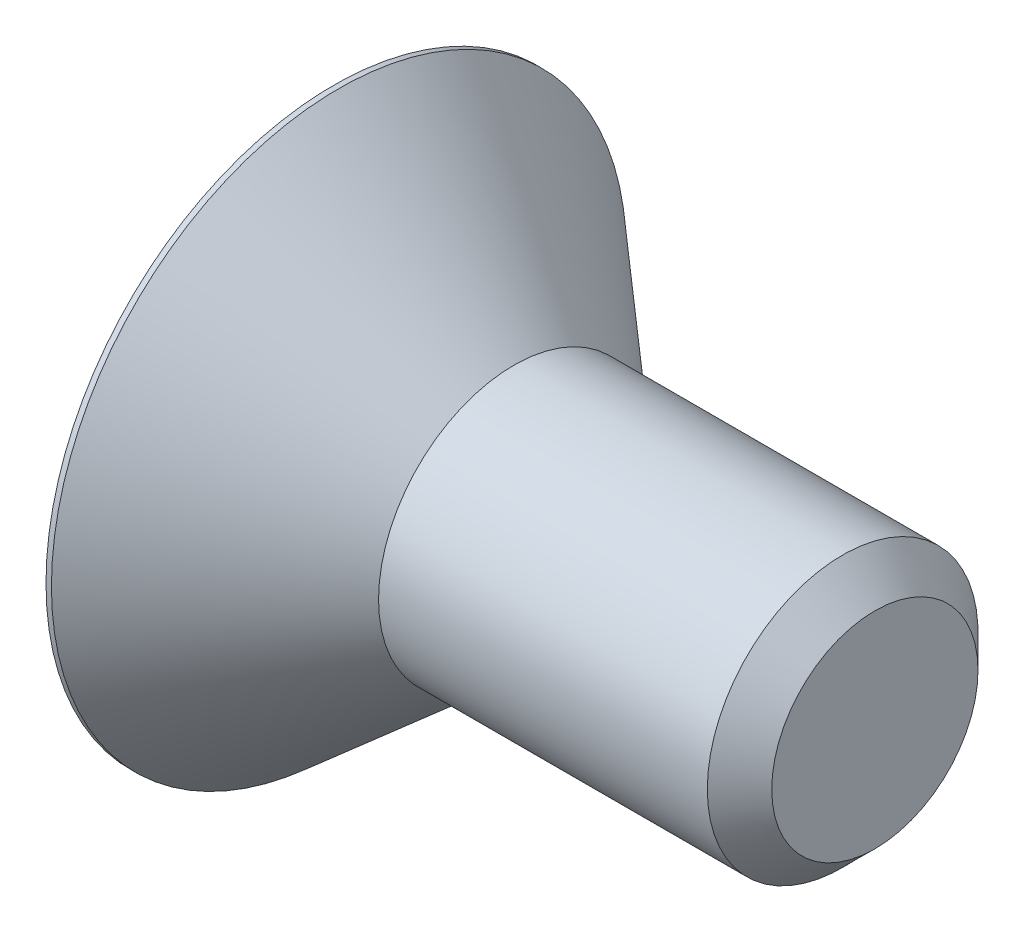
ISO-10303-21;
HEADER;
FILE_DESCRIPTION(('STEP AP214'),'2;1');
FILE_NAME('part.step','',(''),(''),'','','');
FILE_SCHEMA(('AUTOMOTIVE_DESIGN { 1 0 10303 214 1 1 1 1 }'));
ENDSEC;
DATA;
#1=APPLICATION_CONTEXT('core data for automotive mechanical design processes');
#2=APPLICATION_PROTOCOL_DEFINITION('international standard','automotive_design',2000,#1);
#3=PRODUCT_CONTEXT('',#1,'mechanical');
#4=PRODUCT('Part','Part','',(#3));
#5=PRODUCT_RELATED_PRODUCT_CATEGORY('part','',(#4));
#6=PRODUCT_DEFINITION_FORMATION('','',#4);
#7=PRODUCT_DEFINITION_CONTEXT('part definition',#1,'design');
#8=PRODUCT_DEFINITION('design','',#6,#7);
#9=PRODUCT_DEFINITION_SHAPE('','',#8);
#10=(LENGTH_UNIT() NAMED_UNIT(*) SI_UNIT(.MILLI.,.METRE.));
#11=(NAMED_UNIT(*) PLANE_ANGLE_UNIT() SI_UNIT($,.RADIAN.));
#12=(NAMED_UNIT(*) SI_UNIT($,.STERADIAN.) SOLID_ANGLE_UNIT());
#13=UNCERTAINTY_MEASURE_WITH_UNIT(LENGTH_MEASURE(1.E-05),#10,'distance_accuracy_value','');
#14=(GEOMETRIC_REPRESENTATION_CONTEXT(3) GLOBAL_UNCERTAINTY_ASSIGNED_CONTEXT((#13)) GLOBAL_UNIT_ASSIGNED_CONTEXT((#10,
#11,#12)) REPRESENTATION_CONTEXT('',''));
#15=CARTESIAN_POINT('',(0.,0.,0.));
#16=DIRECTION('',(0.,0.,1.));
#17=DIRECTION('',(1.,0.,0.));
#18=AXIS2_PLACEMENT_3D('',#15,#16,#17);
#19=CARTESIAN_POINT('',(0.,0.,0.));
#20=DIRECTION('',(-1.,0.,0.));
#21=DIRECTION('',(0.,0.,1.));
#22=AXIS2_PLACEMENT_3D('',#19,#20,#21);
#23=PLANE('',#22);
#24=CARTESIAN_POINT('',(0.,0.,0.));
#25=DIRECTION('',(-1.,0.,0.));
#26=DIRECTION('',(0.,0.,1.));
#27=AXIS2_PLACEMENT_3D('',#24,#25,#26);
#28=CIRCLE('',#27,6.7437);
#29=CARTESIAN_POINT('',(0.,0.,6.7437));
#30=VERTEX_POINT('',#29);
#31=EDGE_CURVE('E11',#30,#30,#28,.T.);
#32=ORIENTED_EDGE('',*,*,#31,.T.);
#33=EDGE_LOOP('',(#32));
#34=FACE_BOUND('',#33,.T.);
#35=DIRECTION('',(0.,-0.5,-0.866025403784439));
#36=VECTOR('',#35,1.);
#37=CARTESIAN_POINT('',(0.,-1.14384635331848,1.9812));
#38=LINE('',#37,#36);
#39=CARTESIAN_POINT('',(0.,-1.14384635331848,1.9812));
#40=VERTEX_POINT('',#39);
#41=CARTESIAN_POINT('',(0.,-2.28769270663697,0.));
#42=VERTEX_POINT('',#41);
#43=EDGE_CURVE('E125',#40,#42,#38,.T.);
#44=ORIENTED_EDGE('',*,*,#43,.T.);
#45=DIRECTION('',(0.,0.5,-0.866025403784439));
#46=VECTOR('',#45,1.);
#47=CARTESIAN_POINT('',(0.,-2.28769270663697,0.));
#48=LINE('',#47,#46);
#49=CARTESIAN_POINT('',(0.,-1.14384635331848,-1.9812));
#50=VERTEX_POINT('',#49);
#51=EDGE_CURVE('E47',#42,#50,#48,.T.);
#52=ORIENTED_EDGE('',*,*,#51,.T.);
#53=DIRECTION('',(0.,1.,0.));
#54=VECTOR('',#53,1.);
#55=CARTESIAN_POINT('',(0.,-1.14384635331848,-1.9812));
#56=LINE('',#55,#54);
#57=CARTESIAN_POINT('',(0.,1.14384635331849,-1.9812));
#58=VERTEX_POINT('',#57);
#59=EDGE_CURVE('E108',#50,#58,#56,.T.);
#60=ORIENTED_EDGE('',*,*,#59,.T.);
#61=DIRECTION('',(0.,0.5,0.866025403784439));
#62=VECTOR('',#61,1.);
#63=CARTESIAN_POINT('',(0.,1.14384635331849,-1.9812));
#64=LINE('',#63,#62);
#65=CARTESIAN_POINT('',(0.,2.28769270663697,0.));
#66=VERTEX_POINT('',#65);
#67=EDGE_CURVE('E115',#58,#66,#64,.T.);
#68=ORIENTED_EDGE('',*,*,#67,.T.);
#69=DIRECTION('',(0.,-0.5,0.866025403784439));
#70=VECTOR('',#69,1.);
#71=CARTESIAN_POINT('',(0.,2.28769270663697,0.));
#72=LINE('',#71,#70);
#73=CARTESIAN_POINT('',(0.,1.14384635331849,1.9812));
#74=VERTEX_POINT('',#73);
#75=EDGE_CURVE('E129',#66,#74,#72,.T.);
#76=ORIENTED_EDGE('',*,*,#75,.T.);
#77=DIRECTION('',(0.,-1.,0.));
#78=VECTOR('',#77,1.);
#79=CARTESIAN_POINT('',(0.,1.14384635331849,1.9812));
#80=LINE('',#79,#78);
#81=EDGE_CURVE('E132',#74,#40,#80,.T.);
#82=ORIENTED_EDGE('',*,*,#81,.T.);
#83=EDGE_LOOP('',(#44,#52,#60,#68,#76,#82));
#84=FACE_BOUND('',#83,.T.);
#85=ADVANCED_FACE('F33',(#34,#84),#23,.T.);
#86=CARTESIAN_POINT('',(0.,0.,0.));
#87=DIRECTION('',(-1.,0.,0.));
#88=DIRECTION('',(0.,0.,1.));
#89=AXIS2_PLACEMENT_3D('',#86,#87,#88);
#90=CYLINDRICAL_SURFACE('',#89,6.7437);
#91=CARTESIAN_POINT('',(0.127,0.,0.));
#92=DIRECTION('',(-1.,0.,0.));
#93=DIRECTION('',(0.,0.,1.));
#94=AXIS2_PLACEMENT_3D('',#91,#92,#93);
#95=CIRCLE('',#94,6.7437);
#96=CARTESIAN_POINT('',(0.127,0.,6.7437));
#97=VERTEX_POINT('',#96);
#98=EDGE_CURVE('E40',#97,#97,#95,.T.);
#99=ORIENTED_EDGE('',*,*,#98,.T.);
#100=EDGE_LOOP('',(#99));
#101=FACE_BOUND('',#100,.T.);
#102=ORIENTED_EDGE('',*,*,#31,.F.);
#103=EDGE_LOOP('',(#102));
#104=FACE_BOUND('',#103,.T.);
#105=ADVANCED_FACE('F182',(#101,#104),#90,.T.);
#106=CARTESIAN_POINT('',(0.127,0.,0.));
#107=DIRECTION('',(-1.,0.,0.));
#108=DIRECTION('',(0.,0.,1.));
#109=AXIS2_PLACEMENT_3D('',#106,#107,#108);
#110=CONICAL_SURFACE('',#109,6.7437,0.715584993317677);
#111=CARTESIAN_POINT('',(4.2323197348496,0.,0.));
#112=DIRECTION('',(-1.,0.,0.));
#113=DIRECTION('',(0.,0.,1.));
#114=AXIS2_PLACEMENT_3D('',#111,#112,#113);
#115=CIRCLE('',#114,3.175);
#116=CARTESIAN_POINT('',(4.2323197348496,0.,3.175));
#117=VERTEX_POINT('',#116);
#118=EDGE_CURVE('E177',#117,#117,#115,.T.);
#119=ORIENTED_EDGE('',*,*,#118,.T.);
#120=EDGE_LOOP('',(#119));
#121=FACE_BOUND('',#120,.T.);
#122=ORIENTED_EDGE('',*,*,#98,.F.);
#123=EDGE_LOOP('',(#122));
#124=FACE_BOUND('',#123,.T.);
#125=ADVANCED_FACE('F185',(#121,#124),#110,.T.);
#126=CARTESIAN_POINT('',(0.,0.,0.));
#127=DIRECTION('',(-1.,0.,0.));
#128=DIRECTION('',(0.,0.,1.));
#129=AXIS2_PLACEMENT_3D('',#126,#127,#128);
#130=CYLINDRICAL_SURFACE('',#129,3.175);
#131=CARTESIAN_POINT('',(11.94435,0.,0.));
#132=DIRECTION('',(-1.,0.,0.));
#133=DIRECTION('',(0.,0.,1.));
#134=AXIS2_PLACEMENT_3D('',#131,#132,#133);
#135=CIRCLE('',#134,3.175);
#136=CARTESIAN_POINT('',(11.94435,0.,3.175));
#137=VERTEX_POINT('',#136);
#138=EDGE_CURVE('E174',#137,#137,#135,.T.);
#139=ORIENTED_EDGE('',*,*,#138,.T.);
#140=EDGE_LOOP('',(#139));
#141=FACE_BOUND('',#140,.T.);
#142=ORIENTED_EDGE('',*,*,#118,.F.);
#143=EDGE_LOOP('',(#142));
#144=FACE_BOUND('',#143,.T.);
#145=ADVANCED_FACE('F187',(#141,#144),#130,.T.);
#146=CARTESIAN_POINT('',(12.7,0.,0.));
#147=DIRECTION('',(-1.,0.,0.));
#148=DIRECTION('',(0.,0.,1.));
#149=AXIS2_PLACEMENT_3D('',#146,#147,#148);
#150=CONICAL_SURFACE('',#149,2.41935,0.785398163397453);
#151=ORIENTED_EDGE('',*,*,#138,.F.);
#152=EDGE_LOOP('',(#151));
#153=FACE_BOUND('',#152,.T.);
#154=CARTESIAN_POINT('',(12.7,0.,0.));
#155=DIRECTION('',(-1.,0.,0.));
#156=DIRECTION('',(0.,0.,1.));
#157=AXIS2_PLACEMENT_3D('',#154,#155,#156);
#158=CIRCLE('',#157,2.41935);
#159=CARTESIAN_POINT('',(12.7,0.,2.41935));
#160=VERTEX_POINT('',#159);
#161=EDGE_CURVE('E170',#160,#160,#158,.T.);
#162=ORIENTED_EDGE('',*,*,#161,.T.);
#163=EDGE_LOOP('',(#162));
#164=FACE_BOUND('',#163,.T.);
#165=ADVANCED_FACE('F194',(#153,#164),#150,.T.);
#166=CARTESIAN_POINT('',(12.7,2.41935,0.));
#167=DIRECTION('',(1.,0.,0.));
#168=DIRECTION('',(0.,0.,-1.));
#169=AXIS2_PLACEMENT_3D('',#166,#167,#168);
#170=PLANE('',#169);
#171=ORIENTED_EDGE('',*,*,#161,.F.);
#172=EDGE_LOOP('',(#171));
#173=FACE_BOUND('',#172,.T.);
#174=ADVANCED_FACE('F226',(#173),#170,.T.);
#175=CARTESIAN_POINT('',(2.8194,-2.28769270663697,0.));
#176=DIRECTION('',(0.,0.866025403784439,0.5));
#177=DIRECTION('',(0.,-0.5,0.866025403784439));
#178=AXIS2_PLACEMENT_3D('',#175,#176,#177);
#179=PLANE('',#178);
#180=ORIENTED_EDGE('',*,*,#51,.F.);
#181=DIRECTION('',(-1.,0.,0.));
#182=VECTOR('',#181,1.);
#183=CARTESIAN_POINT('',(2.8194,-2.28769270663697,0.));
#184=LINE('',#183,#182);
#185=CARTESIAN_POINT('',(2.8194,-2.28769270663697,0.));
#186=VERTEX_POINT('',#185);
#187=EDGE_CURVE('E155',#186,#42,#184,.T.);
#188=ORIENTED_EDGE('',*,*,#187,.F.);
#189=DIRECTION('',(0.,0.5,-0.866025403784439));
#190=VECTOR('',#189,1.);
#191=CARTESIAN_POINT('',(2.8194,-2.28769270663697,0.));
#192=LINE('',#191,#190);
#193=CARTESIAN_POINT('',(2.8194,-1.71576952997773,-0.990599999999999));
#194=VERTEX_POINT('',#193);
#195=EDGE_CURVE('E135',#186,#194,#192,.T.);
#196=ORIENTED_EDGE('',*,*,#195,.T.);
#197=CARTESIAN_POINT('',(2.8194,-1.14384635331848,-1.9812));
#198=VERTEX_POINT('',#197);
#199=EDGE_CURVE('E120',#194,#198,#192,.T.);
#200=ORIENTED_EDGE('',*,*,#199,.T.);
#201=DIRECTION('',(-1.,0.,0.));
#202=VECTOR('',#201,1.);
#203=CARTESIAN_POINT('',(2.8194,-1.14384635331848,-1.9812));
#204=LINE('',#203,#202);
#205=EDGE_CURVE('E110',#198,#50,#204,.T.);
#206=ORIENTED_EDGE('',*,*,#205,.T.);
#207=EDGE_LOOP('',(#180,#188,#196,#200,#206));
#208=FACE_BOUND('',#207,.T.);
#209=ADVANCED_FACE('F117',(#208),#179,.T.);
#210=CARTESIAN_POINT('',(2.8194,-1.14384635331848,-1.9812));
#211=DIRECTION('',(0.,0.,1.));
#212=DIRECTION('',(1.,0.,0.));
#213=AXIS2_PLACEMENT_3D('',#210,#211,#212);
#214=PLANE('',#213);
#215=ORIENTED_EDGE('',*,*,#59,.F.);
#216=ORIENTED_EDGE('',*,*,#205,.F.);
#217=DIRECTION('',(0.,1.,0.));
#218=VECTOR('',#217,1.);
#219=CARTESIAN_POINT('',(2.8194,-1.14384635331848,-1.9812));
#220=LINE('',#219,#218);
#221=CARTESIAN_POINT('',(2.8194,0.,-1.9812));
#222=VERTEX_POINT('',#221);
#223=EDGE_CURVE('E55',#198,#222,#220,.T.);
#224=ORIENTED_EDGE('',*,*,#223,.T.);
#225=CARTESIAN_POINT('',(2.8194,1.14384635331849,-1.9812));
#226=VERTEX_POINT('',#225);
#227=EDGE_CURVE('E137',#222,#226,#220,.T.);
#228=ORIENTED_EDGE('',*,*,#227,.T.);
#229=DIRECTION('',(-1.,0.,0.));
#230=VECTOR('',#229,1.);
#231=CARTESIAN_POINT('',(2.8194,1.14384635331849,-1.9812));
#232=LINE('',#231,#230);
#233=EDGE_CURVE('E112',#226,#58,#232,.T.);
#234=ORIENTED_EDGE('',*,*,#233,.T.);
#235=EDGE_LOOP('',(#215,#216,#224,#228,#234));
#236=FACE_BOUND('',#235,.T.);
#237=ADVANCED_FACE('F109',(#236),#214,.T.);
#238=CARTESIAN_POINT('',(2.8194,1.14384635331849,-1.9812));
#239=DIRECTION('',(0.,-0.866025403784439,0.5));
#240=DIRECTION('',(0.,-0.5,-0.866025403784439));
#241=AXIS2_PLACEMENT_3D('',#238,#239,#240);
#242=PLANE('',#241);
#243=ORIENTED_EDGE('',*,*,#67,.F.);
#244=ORIENTED_EDGE('',*,*,#233,.F.);
#245=DIRECTION('',(0.,0.5,0.866025403784439));
#246=VECTOR('',#245,1.);
#247=CARTESIAN_POINT('',(2.8194,1.14384635331849,-1.9812));
#248=LINE('',#247,#246);
#249=CARTESIAN_POINT('',(2.8194,1.71576952997773,-0.9906));
#250=VERTEX_POINT('',#249);
#251=EDGE_CURVE('E140',#226,#250,#248,.T.);
#252=ORIENTED_EDGE('',*,*,#251,.T.);
#253=CARTESIAN_POINT('',(2.8194,2.28769270663697,0.));
#254=VERTEX_POINT('',#253);
#255=EDGE_CURVE('E139',#250,#254,#248,.T.);
#256=ORIENTED_EDGE('',*,*,#255,.T.);
#257=DIRECTION('',(-1.,0.,0.));
#258=VECTOR('',#257,1.);
#259=CARTESIAN_POINT('',(2.8194,2.28769270663697,0.));
#260=LINE('',#259,#258);
#261=EDGE_CURVE('E163',#254,#66,#260,.T.);
#262=ORIENTED_EDGE('',*,*,#261,.T.);
#263=EDGE_LOOP('',(#243,#244,#252,#256,#262));
#264=FACE_BOUND('',#263,.T.);
#265=ADVANCED_FACE('F250',(#264),#242,.T.);
#266=CARTESIAN_POINT('',(2.8194,2.28769270663697,0.));
#267=DIRECTION('',(0.,-0.866025403784439,-0.5));
#268=DIRECTION('',(0.,0.5,-0.866025403784439));
#269=AXIS2_PLACEMENT_3D('',#266,#267,#268);
#270=PLANE('',#269);
#271=ORIENTED_EDGE('',*,*,#75,.F.);
#272=ORIENTED_EDGE('',*,*,#261,.F.);
#273=DIRECTION('',(0.,-0.5,0.866025403784439));
#274=VECTOR('',#273,1.);
#275=CARTESIAN_POINT('',(2.8194,2.28769270663697,0.));
#276=LINE('',#275,#274);
#277=CARTESIAN_POINT('',(2.8194,1.71576952997773,0.9906));
#278=VERTEX_POINT('',#277);
#279=EDGE_CURVE('E144',#254,#278,#276,.T.);
#280=ORIENTED_EDGE('',*,*,#279,.T.);
#281=CARTESIAN_POINT('',(2.8194,1.14384635331849,1.9812));
#282=VERTEX_POINT('',#281);
#283=EDGE_CURVE('E143',#278,#282,#276,.T.);
#284=ORIENTED_EDGE('',*,*,#283,.T.);
#285=DIRECTION('',(-1.,0.,0.));
#286=VECTOR('',#285,1.);
#287=CARTESIAN_POINT('',(2.8194,1.14384635331849,1.9812));
#288=LINE('',#287,#286);
#289=EDGE_CURVE('E160',#282,#74,#288,.T.);
#290=ORIENTED_EDGE('',*,*,#289,.T.);
#291=EDGE_LOOP('',(#271,#272,#280,#284,#290));
#292=FACE_BOUND('',#291,.T.);
#293=ADVANCED_FACE('F257',(#292),#270,.T.);
#294=CARTESIAN_POINT('',(2.8194,1.14384635331849,1.9812));
#295=DIRECTION('',(0.,0.,-1.));
#296=DIRECTION('',(-1.,0.,0.));
#297=AXIS2_PLACEMENT_3D('',#294,#295,#296);
#298=PLANE('',#297);
#299=ORIENTED_EDGE('',*,*,#81,.F.);
#300=ORIENTED_EDGE('',*,*,#289,.F.);
#301=DIRECTION('',(0.,-1.,0.));
#302=VECTOR('',#301,1.);
#303=CARTESIAN_POINT('',(2.8194,1.14384635331849,1.9812));
#304=LINE('',#303,#302);
#305=CARTESIAN_POINT('',(2.8194,0.,1.9812));
#306=VERTEX_POINT('',#305);
#307=EDGE_CURVE('E148',#282,#306,#304,.T.);
#308=ORIENTED_EDGE('',*,*,#307,.T.);
#309=CARTESIAN_POINT('',(2.8194,-1.14384635331848,1.9812));
#310=VERTEX_POINT('',#309);
#311=EDGE_CURVE('E147',#306,#310,#304,.T.);
#312=ORIENTED_EDGE('',*,*,#311,.T.);
#313=DIRECTION('',(-1.,0.,0.));
#314=VECTOR('',#313,1.);
#315=CARTESIAN_POINT('',(2.8194,-1.14384635331848,1.9812));
#316=LINE('',#315,#314);
#317=EDGE_CURVE('E157',#310,#40,#316,.T.);
#318=ORIENTED_EDGE('',*,*,#317,.T.);
#319=EDGE_LOOP('',(#299,#300,#308,#312,#318));
#320=FACE_BOUND('',#319,.T.);
#321=ADVANCED_FACE('F265',(#320),#298,.T.);
#322=CARTESIAN_POINT('',(2.8194,-1.14384635331848,1.9812));
#323=DIRECTION('',(0.,0.866025403784439,-0.5));
#324=DIRECTION('',(0.,0.5,0.866025403784439));
#325=AXIS2_PLACEMENT_3D('',#322,#323,#324);
#326=PLANE('',#325);
#327=ORIENTED_EDGE('',*,*,#43,.F.);
#328=ORIENTED_EDGE('',*,*,#317,.F.);
#329=DIRECTION('',(0.,-0.5,-0.866025403784439));
#330=VECTOR('',#329,1.);
#331=CARTESIAN_POINT('',(2.8194,-1.14384635331848,1.9812));
#332=LINE('',#331,#330);
#333=CARTESIAN_POINT('',(2.8194,-1.71576952997773,0.990599999999999));
#334=VERTEX_POINT('',#333);
#335=EDGE_CURVE('E152',#310,#334,#332,.T.);
#336=ORIENTED_EDGE('',*,*,#335,.T.);
#337=EDGE_CURVE('E151',#334,#186,#332,.T.);
#338=ORIENTED_EDGE('',*,*,#337,.T.);
#339=ORIENTED_EDGE('',*,*,#187,.T.);
#340=EDGE_LOOP('',(#327,#328,#336,#338,#339));
#341=FACE_BOUND('',#340,.T.);
#342=ADVANCED_FACE('F273',(#341),#326,.T.);
#343=CARTESIAN_POINT('',(2.8194,-1.14384635331848,-1.9812));
#344=DIRECTION('',(1.,0.,0.));
#345=DIRECTION('',(0.,0.,-1.));
#346=AXIS2_PLACEMENT_3D('',#343,#344,#345);
#347=PLANE('',#346);
#348=ORIENTED_EDGE('',*,*,#223,.F.);
#349=ORIENTED_EDGE('',*,*,#199,.F.);
#350=CARTESIAN_POINT('',(2.8194,0.,0.));
#351=DIRECTION('',(-1.,0.,0.));
#352=DIRECTION('',(0.,0.,1.));
#353=AXIS2_PLACEMENT_3D('',#350,#351,#352);
#354=CIRCLE('',#353,1.9812);
#355=EDGE_CURVE('E379',#222,#194,#354,.T.);
#356=ORIENTED_EDGE('',*,*,#355,.F.);
#357=EDGE_LOOP('',(#348,#349,#356));
#358=FACE_BOUND('',#357,.T.);
#359=ADVANCED_FACE('F281',(#358),#347,.F.);
#360=ORIENTED_EDGE('',*,*,#195,.F.);
#361=ORIENTED_EDGE('',*,*,#337,.F.);
#362=EDGE_CURVE('E381',#194,#334,#354,.T.);
#363=ORIENTED_EDGE('',*,*,#362,.F.);
#364=EDGE_LOOP('',(#360,#361,#363));
#365=FACE_BOUND('',#364,.T.);
#366=ADVANCED_FACE('F289',(#365),#347,.F.);
#367=ORIENTED_EDGE('',*,*,#335,.F.);
#368=ORIENTED_EDGE('',*,*,#311,.F.);
#369=EDGE_CURVE('E121',#334,#306,#354,.T.);
#370=ORIENTED_EDGE('',*,*,#369,.F.);
#371=EDGE_LOOP('',(#367,#368,#370));
#372=FACE_BOUND('',#371,.T.);
#373=ADVANCED_FACE('F298',(#372),#347,.F.);
#374=ORIENTED_EDGE('',*,*,#307,.F.);
#375=ORIENTED_EDGE('',*,*,#283,.F.);
#376=EDGE_CURVE('E167',#306,#278,#354,.T.);
#377=ORIENTED_EDGE('',*,*,#376,.F.);
#378=EDGE_LOOP('',(#374,#375,#377));
#379=FACE_BOUND('',#378,.T.);
#380=ADVANCED_FACE('F305',(#379),#347,.F.);
#381=ORIENTED_EDGE('',*,*,#279,.F.);
#382=ORIENTED_EDGE('',*,*,#255,.F.);
#383=EDGE_CURVE('E171',#278,#250,#354,.T.);
#384=ORIENTED_EDGE('',*,*,#383,.F.);
#385=EDGE_LOOP('',(#381,#382,#384));
#386=FACE_BOUND('',#385,.T.);
#387=ADVANCED_FACE('F312',(#386),#347,.F.);
#388=ORIENTED_EDGE('',*,*,#251,.F.);
#389=ORIENTED_EDGE('',*,*,#227,.F.);
#390=EDGE_CURVE('E378',#250,#222,#354,.T.);
#391=ORIENTED_EDGE('',*,*,#390,.F.);
#392=EDGE_LOOP('',(#388,#389,#391));
#393=FACE_BOUND('',#392,.T.);
#394=ADVANCED_FACE('F292',(#393),#347,.F.);
#395=CARTESIAN_POINT('',(2.8194,0.,0.));
#396=DIRECTION('',(-1.,0.,0.));
#397=DIRECTION('',(0.,0.,1.));
#398=AXIS2_PLACEMENT_3D('',#395,#396,#397);
#399=CONICAL_SURFACE('',#398,1.9812,1.04719755119659);
#400=CARTESIAN_POINT('',(3.9632463533185,0.,0.));
#401=VERTEX_POINT('',#400);
#402=VERTEX_LOOP('',#401);
#403=FACE_BOUND('',#402,.T.);
#404=ORIENTED_EDGE('',*,*,#376,.T.);
#405=ORIENTED_EDGE('',*,*,#383,.T.);
#406=ORIENTED_EDGE('',*,*,#390,.T.);
#407=ORIENTED_EDGE('',*,*,#355,.T.);
#408=ORIENTED_EDGE('',*,*,#362,.T.);
#409=ORIENTED_EDGE('',*,*,#369,.T.);
#410=EDGE_LOOP('',(#404,#405,#406,#407,#408,#409));
#411=FACE_BOUND('',#410,.T.);
#412=ADVANCED_FACE('F325',(#403,#411),#399,.F.);
#413=CLOSED_SHELL('',(#85,#105,#125,#145,#165,#174,#209,#237,#265,#293,#321,#342,#359,#366,#373,
#380,#387,#394,#412));
#414=MANIFOLD_SOLID_BREP('B2',#413);
#415=ADVANCED_BREP_SHAPE_REPRESENTATION('',(#18,#414),#14);
#416=SHAPE_DEFINITION_REPRESENTATION(#9,#415);
ENDSEC;
END-ISO-10303-21;
